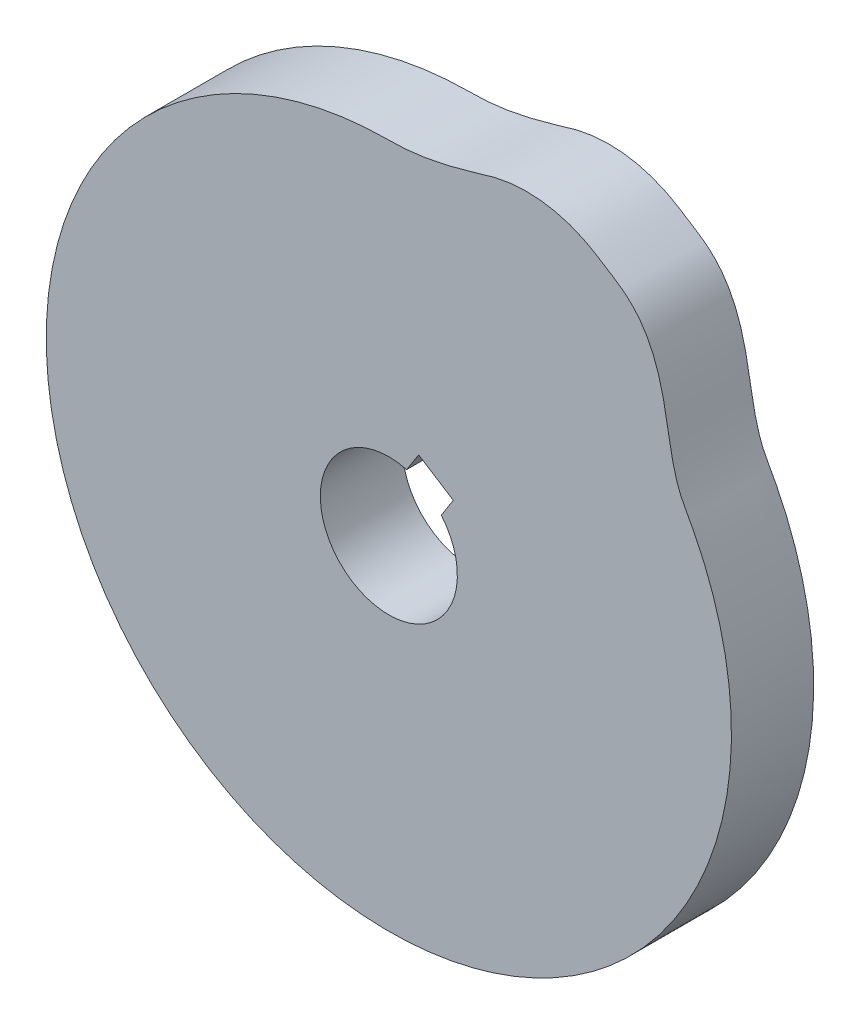
ISO-10303-21;
HEADER;
FILE_DESCRIPTION(('STEP AP214'),'2;1');
FILE_NAME('part.step','',(''),(''),'','','');
FILE_SCHEMA(('AUTOMOTIVE_DESIGN { 1 0 10303 214 1 1 1 1 }'));
ENDSEC;
DATA;
#1=APPLICATION_CONTEXT('core data for automotive mechanical design processes');
#2=APPLICATION_PROTOCOL_DEFINITION('international standard','automotive_design',2000,#1);
#3=PRODUCT_CONTEXT('',#1,'mechanical');
#4=PRODUCT('Part','Part','',(#3));
#5=PRODUCT_RELATED_PRODUCT_CATEGORY('part','',(#4));
#6=PRODUCT_DEFINITION_FORMATION('','',#4);
#7=PRODUCT_DEFINITION_CONTEXT('part definition',#1,'design');
#8=PRODUCT_DEFINITION('design','',#6,#7);
#9=PRODUCT_DEFINITION_SHAPE('','',#8);
#10=(LENGTH_UNIT() NAMED_UNIT(*) SI_UNIT(.MILLI.,.METRE.));
#11=(NAMED_UNIT(*) PLANE_ANGLE_UNIT() SI_UNIT($,.RADIAN.));
#12=(NAMED_UNIT(*) SI_UNIT($,.STERADIAN.) SOLID_ANGLE_UNIT());
#13=UNCERTAINTY_MEASURE_WITH_UNIT(LENGTH_MEASURE(1.E-05),#10,'distance_accuracy_value','');
#14=(GEOMETRIC_REPRESENTATION_CONTEXT(3) GLOBAL_UNCERTAINTY_ASSIGNED_CONTEXT((#13)) GLOBAL_UNIT_ASSIGNED_CONTEXT((#10,
#11,#12)) REPRESENTATION_CONTEXT('',''));
#15=CARTESIAN_POINT('',(0.,0.,0.));
#16=DIRECTION('',(0.,0.,1.));
#17=DIRECTION('',(1.,0.,0.));
#18=AXIS2_PLACEMENT_3D('',#15,#16,#17);
#19=CARTESIAN_POINT('',(-25.8673504127022,-42.7887857110537,12.));
#20=DIRECTION('',(0.,0.,1.));
#21=DIRECTION('',(1.,0.,0.));
#22=AXIS2_PLACEMENT_3D('',#19,#20,#21);
#23=PLANE('',#22);
#24=CARTESIAN_POINT('',(30.6076222314708,50.4398003697039,12.));
#25=CARTESIAN_POINT('',(30.4803171456213,50.5170509921739,12.));
#26=CARTESIAN_POINT('',(30.2251220550456,50.6705883206375,12.));
#27=CARTESIAN_POINT('',(29.8405717379502,50.8980039132595,12.));
#28=CARTESIAN_POINT('',(29.5830808396817,51.0476591263146,12.));
#29=CARTESIAN_POINT('',(29.45405395359,51.1219982561227,12.));
#30=CARTESIAN_POINT('',(29.3343916221048,51.190941976791,12.));
#31=CARTESIAN_POINT('',(29.0945828251039,51.3279891297548,12.));
#32=CARTESIAN_POINT('',(28.7266436495151,51.5192594054611,12.));
#33=CARTESIAN_POINT('',(28.4796336448281,51.6428921235424,12.));
#34=CARTESIAN_POINT('',(28.3554456590838,51.7033044930774,12.));
#35=CARTESIAN_POINT('',(28.1263094948855,51.8147698537758,12.));
#36=CARTESIAN_POINT('',(27.5822316556157,52.0655477221545,12.));
#37=CARTESIAN_POINT('',(26.7062807005346,52.4183726926784,12.));
#38=CARTESIAN_POINT('',(25.7253796970024,52.7508214398549,12.));
#39=CARTESIAN_POINT('',(24.7241173343735,53.0287501147325,12.));
#40=CARTESIAN_POINT('',(23.7047408080316,53.2512721730611,12.));
#41=CARTESIAN_POINT('',(22.6695261443255,53.4175728550292,12.));
#42=CARTESIAN_POINT('',(21.6207763299688,53.526913209372,12.));
#43=CARTESIAN_POINT('',(20.5608207801787,53.5786244975551,12.));
#44=CARTESIAN_POINT('',(19.4920064868158,53.572131269909,12.));
#45=CARTESIAN_POINT('',(18.4167213457121,53.5068679615972,12.));
#46=CARTESIAN_POINT('',(17.3372956630495,53.3825968058903,12.));
#47=CARTESIAN_POINT('',(16.2563642170177,53.1982084304997,12.));
#48=CARTESIAN_POINT('',(15.1754853721839,52.9562641405376,12.));
#49=CARTESIAN_POINT('',(14.1071304592976,52.6477430423425,12.));
#50=CARTESIAN_POINT('',(13.0545650116408,52.3181134437937,12.));
#51=CARTESIAN_POINT('',(12.0171036529371,52.0128716553444,12.));
#52=CARTESIAN_POINT('',(11.0033137471876,51.7244956022475,12.));
#53=CARTESIAN_POINT('',(10.0106548147003,51.4565523820743,12.));
#54=CARTESIAN_POINT('',(9.03765192704429,51.2091187240952,12.));
#55=CARTESIAN_POINT('',(8.0825275435847,50.9830913898652,12.));
#56=CARTESIAN_POINT('',(7.1435574408388,50.7790741364261,12.));
#57=CARTESIAN_POINT('',(6.21898166426566,50.5976645706676,12.));
#58=CARTESIAN_POINT('',(5.30703053672776,50.4393789888941,12.));
#59=CARTESIAN_POINT('',(4.40592081794857,50.3046710893957,12.));
#60=CARTESIAN_POINT('',(3.51385960463469,50.1939254783646,12.));
#61=CARTESIAN_POINT('',(2.91712460533482,50.1356118565322,12.));
#62=CARTESIAN_POINT('',(2.61800180454818,50.1105405983444,12.));
#63=CARTESIAN_POINT('',(2.61389346650665,50.1101970382042,12.));
#64=CARTESIAN_POINT('',(2.01333468198642,50.0599752555557,12.));
#65=CARTESIAN_POINT('',(0.809434420460247,49.9928074986587,12.));
#66=CARTESIAN_POINT('',(-1.00036901814609,50.0008931514634,12.));
#67=CARTESIAN_POINT('',(-2.20500183421003,49.9549913421296,12.));
#68=CARTESIAN_POINT('',(-2.80670661638772,49.9211618251171,12.));
#69=CARTESIAN_POINT('',(-63.6873338742389,46.4982835689369,12.));
#70=CARTESIAN_POINT('',(-77.8060253891642,-12.8214384531059,12.));
#71=CARTESIAN_POINT('',(-24.9952388642575,-43.3040186832436,12.));
#72=CARTESIAN_POINT('',(27.8155476606491,-73.7865989133813,12.));
#73=CARTESIAN_POINT('',(72.1193760763282,-31.8898489370393,12.));
#74=CARTESIAN_POINT('',(44.63139222023,22.5397166904111,12.));
#75=CARTESIAN_POINT('',(44.3606789525921,23.0757620273209,12.));
#76=CARTESIAN_POINT('',(43.7999378997362,24.1380984960259,12.));
#77=CARTESIAN_POINT('',(42.8798133871297,25.6980522472828,12.));
#78=CARTESIAN_POINT('',(42.4133557878573,26.8066577836474,12.));
#79=CARTESIAN_POINT('',(42.2101352505943,27.3717521914524,12.));
#80=CARTESIAN_POINT('',(42.2062636740594,27.3825178664119,12.));
#81=CARTESIAN_POINT('',(42.099742444955,27.6796646416382,12.));
#82=CARTESIAN_POINT('',(41.9044169904516,28.2761712878325,12.));
#83=CARTESIAN_POINT('',(41.6537837416019,29.1785444381441,12.));
#84=CARTESIAN_POINT('',(41.4310989058594,30.113836174282,12.));
#85=CARTESIAN_POINT('',(41.2298527455138,31.0806895177999,12.));
#86=CARTESIAN_POINT('',(41.0430902436905,32.0769078346977,12.));
#87=CARTESIAN_POINT('',(40.8635548181921,33.0994541734378,12.));
#88=CARTESIAN_POINT('',(40.6838232867233,34.1444730739492,12.));
#89=CARTESIAN_POINT('',(40.4964422802234,35.2073363704446,12.));
#90=CARTESIAN_POINT('',(40.2940629433141,36.2827097342524,12.));
#91=CARTESIAN_POINT('',(40.0695726358915,37.3646371946211,12.));
#92=CARTESIAN_POINT('',(39.8162208746902,38.4466406196374,12.));
#93=CARTESIAN_POINT('',(39.5277369583613,39.5218312507114,12.));
#94=CARTESIAN_POINT('',(39.1984369635733,40.5830303452907,12.));
#95=CARTESIAN_POINT('',(38.8233184291221,41.6228960086812,12.));
#96=CARTESIAN_POINT('',(38.3981416311322,42.6340532922748,12.));
#97=CARTESIAN_POINT('',(37.9194976795186,43.6092254785592,12.));
#98=CARTESIAN_POINT('',(37.3848622805764,44.5413636928394,12.));
#99=CARTESIAN_POINT('',(36.7926413670841,45.4237791301921,12.));
#100=CARTESIAN_POINT('',(36.1421870010684,46.2502617148377,12.));
#101=CARTESIAN_POINT('',(35.4949559134578,46.9492646698083,12.));
#102=CARTESIAN_POINT('',(35.0548254495986,47.3600329852479,12.));
#103=CARTESIAN_POINT('',(34.8631813053917,47.5279340218716,12.));
#104=CARTESIAN_POINT('',(34.7661714799636,47.6129251407992,12.));
#105=CARTESIAN_POINT('',(34.569445018011,47.7798177938221,12.));
#106=CARTESIAN_POINT('',(34.2704872705919,48.0269050235509,12.));
#107=CARTESIAN_POINT('',(34.06002319398,48.1760464797815,12.));
#108=CARTESIAN_POINT('',(33.9545477715554,48.250271352907,12.));
#109=CARTESIAN_POINT('',(33.8249840462497,48.3414475800452,12.));
#110=CARTESIAN_POINT('',(33.5651221045372,48.5227563038857,12.));
#111=CARTESIAN_POINT('',(33.1731222987955,48.7915900352503,12.));
#112=CARTESIAN_POINT('',(32.9103729498426,48.9686884872934,12.));
#113=CARTESIAN_POINT('',(32.7786437481565,49.0567071258502,12.));
#114=CARTESIAN_POINT('',(32.0650862591673,49.5334909969201,12.));
#115=CARTESIAN_POINT('',(31.3412975922036,49.9945952317522,12.));
#116=CARTESIAN_POINT('',(30.6076222314707,50.4398003697039,12.));
#117=(BOUNDED_CURVE() B_SPLINE_CURVE(3,(#24,#25,#26,#27,#28,#29,#30,#31,#32,#33,#34,#35,#36,#37,
#38,#39,#40,#41,#42,#43,#44,#45,#46,#47,#48,#49,#50,#51,#52,#53,#54,#55,#56,#57,#58,#59,#60,#61,
#62,#63,#64,#65,#66,#67,#68,#69,#70,#71,#72,#73,#74,#75,#76,#77,#78,#79,#80,#81,#82,#83,#84,#85,
#86,#87,#88,#89,#90,#91,#92,#93,#94,#95,#96,#97,#98,#99,#100,#101,#102,#103,#104,#105,#106,#107,
#108,#109,#110,#111,#112,#113,#114,#115,#116),.UNSPECIFIED.,.T.,
.F.) B_SPLINE_CURVE_WITH_KNOTS((4,1,1,3,1,1,3,1,1,1,1,1,1,1,1,1,1,1,1,1,1,1,1,1,1,1,1,1,1,1,1,1,
1,3,1,1,3,3,3,1,1,3,1,1,1,1,1,1,1,1,1,1,1,1,1,1,1,1,1,1,1,1,1,3,1,1,3,1,1,3,4),(0.,
0.0017280185399754,0.00345603707995079,0.00518405561992608,0.00678665747761953,
0.00838925933531287,0.00999186119300632,0.0129487820272074,0.0169424587147529,
0.0209460538675218,0.0249628609665901,0.0289961628297474,0.0330492291900335,0.0371253144284036,
0.0412276554830441,0.0453594699539005,0.0495239544167746,0.0537242829570546,0.0579636059288933,
0.062245048941568,0.0665717120709554,0.070864939049088,0.075046563540181,0.0791221355688057,
0.0830975777905617,0.0869792035696768,0.0907737311329646,0.0944882924016776,0.0981304350084975,
0.101708116010266,0.105229685944901,0.108703862183379,0.112139691008555,0.112187537200368,
0.119181715992119,0.126175894783869,0.13317007357562,0.503889424590671,0.874608775605722,
0.88157823414906,0.888547692692398,0.895517151235735,0.895649927147662,0.899180615732447,
0.902799581573738,0.906517174789711,0.910338013357844,0.914261272820478,0.918281260338315,
0.92238816590551,0.926568912100945,0.930808050060419,0.935088668650508,0.939393295706877,
0.943704775921545,0.948007110960373,0.952286244755649,0.956530771412662,0.960732535533326,
0.964887086187773,0.968993938445701,0.973056593860924,0.977082278208015,0.980038764166433,
0.981535330565025,0.983031896963616,0.984528463362207,0.986366813124752,0.988205162887297,
0.990043512649842,1.),
.UNSPECIFIED.) CURVE() GEOMETRIC_REPRESENTATION_ITEM() RATIONAL_B_SPLINE_CURVE((1.,1.,1.,1.,1.,
1.,1.,1.,1.,1.,1.,1.,1.,1.,1.,1.,1.,1.,1.,1.,1.,1.,1.,1.,1.,1.,1.,1.,1.,1.,1.,1.,1.,1.,1.,1.,1.,
1.,1.,1.,1.,1.,1.,1.,1.,0.523857144136756,0.523857144136756,1.,0.523857144136756,
0.523857144136756,1.,1.,1.,1.,1.,1.,1.,1.,1.,1.,1.,1.,1.,1.,1.,1.,1.,1.,1.,1.,1.,1.,1.,1.,1.,1.,
1.,1.,1.,1.,1.,1.,1.,1.,1.,1.,1.,1.,1.,1.,0.999841351386606,0.999841351386606,1.)) REPRESENTATION_ITEM(''));
#118=CARTESIAN_POINT('',(30.6076222314708,50.4398003697039,12.));
#119=VERTEX_POINT('',#118);
#120=EDGE_CURVE('E119',#119,#119,#117,.T.);
#121=ORIENTED_EDGE('',*,*,#120,.T.);
#122=EDGE_LOOP('',(#121));
#123=FACE_BOUND('',#122,.T.);
#124=DIRECTION('',(0.537299608346824,0.843391445812886,0.));
#125=VECTOR('',#124,1.);
#126=CARTESIAN_POINT('',(9.40760929865756,9.18351164114843,12.));
#127=LINE('',#126,#125);
#128=CARTESIAN_POINT('',(7.65568593051872,6.4335427979658,12.));
#129=VERTEX_POINT('',#128);
#130=CARTESIAN_POINT('',(9.40760929865756,9.18351164114843,12.));
#131=VERTEX_POINT('',#130);
#132=EDGE_CURVE('E93',#129,#131,#127,.T.);
#133=ORIENTED_EDGE('',*,*,#132,.F.);
#134=CARTESIAN_POINT('',(0.,0.,12.));
#135=DIRECTION('',(0.,0.,1.));
#136=DIRECTION('',(1.,0.,0.));
#137=AXIS2_PLACEMENT_3D('',#134,#135,#136);
#138=CIRCLE('',#137,10.);
#139=CARTESIAN_POINT('',(2.59533725564141,9.65734044804675,12.));
#140=VERTEX_POINT('',#139);
#141=EDGE_CURVE('E84',#140,#129,#138,.T.);
#142=ORIENTED_EDGE('',*,*,#141,.F.);
#143=DIRECTION('',(-0.537299608346824,-0.843391445812886,0.));
#144=VECTOR('',#143,1.);
#145=CARTESIAN_POINT('',(2.59533725564141,9.65734044804675,12.));
#146=LINE('',#145,#144);
#147=CARTESIAN_POINT('',(4.34726062378025,12.4073092912294,12.));
#148=VERTEX_POINT('',#147);
#149=EDGE_CURVE('E109',#148,#140,#146,.T.);
#150=ORIENTED_EDGE('',*,*,#149,.F.);
#151=DIRECTION('',(-0.843391445812886,0.537299608346824,0.));
#152=VECTOR('',#151,1.);
#153=CARTESIAN_POINT('',(4.34726062378024,12.4073092912294,12.));
#154=LINE('',#153,#152);
#155=EDGE_CURVE('E105',#131,#148,#154,.T.);
#156=ORIENTED_EDGE('',*,*,#155,.F.);
#157=EDGE_LOOP('',(#133,#142,#150,#156));
#158=FACE_BOUND('',#157,.T.);
#159=ADVANCED_FACE('F43',(#123,#158),#23,.T.);
#160=CARTESIAN_POINT('',(-25.8673504127022,-42.7887857110537,0.));
#161=DIRECTION('',(0.,0.,1.));
#162=DIRECTION('',(1.,0.,0.));
#163=AXIS2_PLACEMENT_3D('',#160,#161,#162);
#164=PLANE('',#163);
#165=CARTESIAN_POINT('',(30.6076222314708,50.4398003697039,0.));
#166=CARTESIAN_POINT('',(30.4803171456213,50.5170509921739,0.));
#167=CARTESIAN_POINT('',(30.2251220550456,50.6705883206375,0.));
#168=CARTESIAN_POINT('',(29.8405717379502,50.8980039132595,0.));
#169=CARTESIAN_POINT('',(29.5830808396817,51.0476591263146,0.));
#170=CARTESIAN_POINT('',(29.45405395359,51.1219982561227,0.));
#171=CARTESIAN_POINT('',(29.3343916221048,51.190941976791,0.));
#172=CARTESIAN_POINT('',(29.0945828251039,51.3279891297548,0.));
#173=CARTESIAN_POINT('',(28.7266436495151,51.5192594054611,0.));
#174=CARTESIAN_POINT('',(28.4796336448281,51.6428921235424,0.));
#175=CARTESIAN_POINT('',(28.3554456590838,51.7033044930774,0.));
#176=CARTESIAN_POINT('',(28.1263094948855,51.8147698537758,0.));
#177=CARTESIAN_POINT('',(27.5822316556157,52.0655477221545,0.));
#178=CARTESIAN_POINT('',(26.7062807005346,52.4183726926784,0.));
#179=CARTESIAN_POINT('',(25.7253796970024,52.7508214398549,0.));
#180=CARTESIAN_POINT('',(24.7241173343735,53.0287501147325,0.));
#181=CARTESIAN_POINT('',(23.7047408080316,53.2512721730611,0.));
#182=CARTESIAN_POINT('',(22.6695261443255,53.4175728550292,0.));
#183=CARTESIAN_POINT('',(21.6207763299688,53.526913209372,0.));
#184=CARTESIAN_POINT('',(20.5608207801787,53.5786244975551,0.));
#185=CARTESIAN_POINT('',(19.4920064868158,53.572131269909,0.));
#186=CARTESIAN_POINT('',(18.4167213457121,53.5068679615972,0.));
#187=CARTESIAN_POINT('',(17.3372956630495,53.3825968058903,0.));
#188=CARTESIAN_POINT('',(16.2563642170177,53.1982084304997,0.));
#189=CARTESIAN_POINT('',(15.1754853721839,52.9562641405376,0.));
#190=CARTESIAN_POINT('',(14.1071304592976,52.6477430423425,0.));
#191=CARTESIAN_POINT('',(13.0545650116408,52.3181134437937,0.));
#192=CARTESIAN_POINT('',(12.0171036529371,52.0128716553444,0.));
#193=CARTESIAN_POINT('',(11.0033137471876,51.7244956022475,0.));
#194=CARTESIAN_POINT('',(10.0106548147003,51.4565523820743,0.));
#195=CARTESIAN_POINT('',(9.03765192704429,51.2091187240952,0.));
#196=CARTESIAN_POINT('',(8.0825275435847,50.9830913898652,0.));
#197=CARTESIAN_POINT('',(7.1435574408388,50.7790741364261,0.));
#198=CARTESIAN_POINT('',(6.21898166426566,50.5976645706676,0.));
#199=CARTESIAN_POINT('',(5.30703053672776,50.4393789888941,0.));
#200=CARTESIAN_POINT('',(4.40592081794857,50.3046710893957,0.));
#201=CARTESIAN_POINT('',(3.51385960463469,50.1939254783646,0.));
#202=CARTESIAN_POINT('',(2.91712460533482,50.1356118565322,0.));
#203=CARTESIAN_POINT('',(2.61800180454818,50.1105405983444,0.));
#204=CARTESIAN_POINT('',(2.61389346650665,50.1101970382042,0.));
#205=CARTESIAN_POINT('',(2.01333468198642,50.0599752555557,0.));
#206=CARTESIAN_POINT('',(0.809434420460247,49.9928074986587,0.));
#207=CARTESIAN_POINT('',(-1.00036901814609,50.0008931514634,0.));
#208=CARTESIAN_POINT('',(-2.20500183421003,49.9549913421296,0.));
#209=CARTESIAN_POINT('',(-2.80670661638772,49.9211618251171,0.));
#210=CARTESIAN_POINT('',(-63.6873338742389,46.4982835689369,0.));
#211=CARTESIAN_POINT('',(-77.8060253891642,-12.8214384531059,0.));
#212=CARTESIAN_POINT('',(-24.9952388642575,-43.3040186832436,0.));
#213=CARTESIAN_POINT('',(27.8155476606491,-73.7865989133813,0.));
#214=CARTESIAN_POINT('',(72.1193760763282,-31.8898489370393,0.));
#215=CARTESIAN_POINT('',(44.63139222023,22.5397166904111,0.));
#216=CARTESIAN_POINT('',(44.3606789525921,23.0757620273209,0.));
#217=CARTESIAN_POINT('',(43.7999378997362,24.1380984960259,0.));
#218=CARTESIAN_POINT('',(42.8798133871297,25.6980522472828,0.));
#219=CARTESIAN_POINT('',(42.4133557878573,26.8066577836474,0.));
#220=CARTESIAN_POINT('',(42.2101352505943,27.3717521914524,0.));
#221=CARTESIAN_POINT('',(42.2062636740594,27.3825178664119,0.));
#222=CARTESIAN_POINT('',(42.099742444955,27.6796646416382,0.));
#223=CARTESIAN_POINT('',(41.9044169904516,28.2761712878325,0.));
#224=CARTESIAN_POINT('',(41.6537837416019,29.1785444381441,0.));
#225=CARTESIAN_POINT('',(41.4310989058594,30.113836174282,0.));
#226=CARTESIAN_POINT('',(41.2298527455138,31.0806895177999,0.));
#227=CARTESIAN_POINT('',(41.0430902436905,32.0769078346977,0.));
#228=CARTESIAN_POINT('',(40.8635548181921,33.0994541734378,0.));
#229=CARTESIAN_POINT('',(40.6838232867233,34.1444730739492,0.));
#230=CARTESIAN_POINT('',(40.4964422802234,35.2073363704446,0.));
#231=CARTESIAN_POINT('',(40.2940629433141,36.2827097342524,0.));
#232=CARTESIAN_POINT('',(40.0695726358915,37.3646371946211,0.));
#233=CARTESIAN_POINT('',(39.8162208746902,38.4466406196374,0.));
#234=CARTESIAN_POINT('',(39.5277369583613,39.5218312507114,0.));
#235=CARTESIAN_POINT('',(39.1984369635733,40.5830303452907,0.));
#236=CARTESIAN_POINT('',(38.8233184291221,41.6228960086812,0.));
#237=CARTESIAN_POINT('',(38.3981416311322,42.6340532922748,0.));
#238=CARTESIAN_POINT('',(37.9194976795186,43.6092254785592,0.));
#239=CARTESIAN_POINT('',(37.3848622805764,44.5413636928394,0.));
#240=CARTESIAN_POINT('',(36.7926413670841,45.4237791301921,0.));
#241=CARTESIAN_POINT('',(36.1421870010684,46.2502617148377,0.));
#242=CARTESIAN_POINT('',(35.4949559134578,46.9492646698083,0.));
#243=CARTESIAN_POINT('',(35.0548254495986,47.3600329852479,0.));
#244=CARTESIAN_POINT('',(34.8631813053917,47.5279340218716,0.));
#245=CARTESIAN_POINT('',(34.7661714799636,47.6129251407992,0.));
#246=CARTESIAN_POINT('',(34.569445018011,47.7798177938221,0.));
#247=CARTESIAN_POINT('',(34.2704872705919,48.0269050235509,0.));
#248=CARTESIAN_POINT('',(34.06002319398,48.1760464797815,0.));
#249=CARTESIAN_POINT('',(33.9545477715554,48.250271352907,0.));
#250=CARTESIAN_POINT('',(33.8249840462497,48.3414475800452,0.));
#251=CARTESIAN_POINT('',(33.5651221045372,48.5227563038857,0.));
#252=CARTESIAN_POINT('',(33.1731222987955,48.7915900352503,0.));
#253=CARTESIAN_POINT('',(32.9103729498426,48.9686884872934,0.));
#254=CARTESIAN_POINT('',(32.7786437481565,49.0567071258502,0.));
#255=CARTESIAN_POINT('',(32.0650862591673,49.5334909969201,0.));
#256=CARTESIAN_POINT('',(31.3412975922036,49.9945952317522,0.));
#257=CARTESIAN_POINT('',(30.6076222314707,50.4398003697039,0.));
#258=(BOUNDED_CURVE() B_SPLINE_CURVE(3,(#165,#166,#167,#168,#169,#170,#171,#172,#173,#174,#175,
#176,#177,#178,#179,#180,#181,#182,#183,#184,#185,#186,#187,#188,#189,#190,#191,#192,#193,#194,
#195,#196,#197,#198,#199,#200,#201,#202,#203,#204,#205,#206,#207,#208,#209,#210,#211,#212,#213,
#214,#215,#216,#217,#218,#219,#220,#221,#222,#223,#224,#225,#226,#227,#228,#229,#230,#231,#232,
#233,#234,#235,#236,#237,#238,#239,#240,#241,#242,#243,#244,#245,#246,#247,#248,#249,#250,#251,
#252,#253,#254,#255,#256,#257),.UNSPECIFIED.,.T.,.F.) B_SPLINE_CURVE_WITH_KNOTS((4,1,1,3,1,1,3,
1,1,1,1,1,1,1,1,1,1,1,1,1,1,1,1,1,1,1,1,1,1,1,1,1,1,3,1,1,3,3,3,1,1,3,1,1,1,1,1,1,1,1,1,1,1,1,1,
1,1,1,1,1,1,1,1,3,1,1,3,1,1,3,4),(0.,0.0017280185399754,0.00345603707995079,0.00518405561992608,
0.00678665747761953,0.00838925933531287,0.00999186119300632,0.0129487820272074,
0.0169424587147529,0.0209460538675218,0.0249628609665901,0.0289961628297474,0.0330492291900335,
0.0371253144284036,0.0412276554830441,0.0453594699539005,0.0495239544167746,0.0537242829570546,
0.0579636059288933,0.062245048941568,0.0665717120709554,0.070864939049088,0.075046563540181,
0.0791221355688057,0.0830975777905617,0.0869792035696768,0.0907737311329646,0.0944882924016776,
0.0981304350084975,0.101708116010266,0.105229685944901,0.108703862183379,0.112139691008555,
0.112187537200368,0.119181715992119,0.126175894783869,0.13317007357562,0.503889424590671,
0.874608775605722,0.88157823414906,0.888547692692398,0.895517151235735,0.895649927147662,
0.899180615732447,0.902799581573738,0.906517174789711,0.910338013357844,0.914261272820478,
0.918281260338315,0.92238816590551,0.926568912100945,0.930808050060419,0.935088668650508,
0.939393295706877,0.943704775921545,0.948007110960373,0.952286244755649,0.956530771412662,
0.960732535533326,0.964887086187773,0.968993938445701,0.973056593860924,0.977082278208015,
0.980038764166433,0.981535330565025,0.983031896963616,0.984528463362207,0.986366813124752,
0.988205162887297,0.990043512649842,1.),
.UNSPECIFIED.) CURVE() GEOMETRIC_REPRESENTATION_ITEM() RATIONAL_B_SPLINE_CURVE((1.,1.,1.,1.,1.,
1.,1.,1.,1.,1.,1.,1.,1.,1.,1.,1.,1.,1.,1.,1.,1.,1.,1.,1.,1.,1.,1.,1.,1.,1.,1.,1.,1.,1.,1.,1.,1.,
1.,1.,1.,1.,1.,1.,1.,1.,0.523857144136756,0.523857144136756,1.,0.523857144136756,
0.523857144136756,1.,1.,1.,1.,1.,1.,1.,1.,1.,1.,1.,1.,1.,1.,1.,1.,1.,1.,1.,1.,1.,1.,1.,1.,1.,1.,
1.,1.,1.,1.,1.,1.,1.,1.,1.,1.,1.,1.,1.,1.,0.999841351386606,0.999841351386606,1.)) REPRESENTATION_ITEM(''));
#259=CARTESIAN_POINT('',(30.6076222314708,50.4398003697039,0.));
#260=VERTEX_POINT('',#259);
#261=EDGE_CURVE('E101',#260,#260,#258,.T.);
#262=ORIENTED_EDGE('',*,*,#261,.F.);
#263=EDGE_LOOP('',(#262));
#264=FACE_BOUND('',#263,.T.);
#265=CARTESIAN_POINT('',(0.,0.,0.));
#266=DIRECTION('',(0.,0.,1.));
#267=DIRECTION('',(1.,0.,0.));
#268=AXIS2_PLACEMENT_3D('',#265,#266,#267);
#269=CIRCLE('',#268,10.);
#270=CARTESIAN_POINT('',(7.65568593051872,6.4335427979658,0.));
#271=VERTEX_POINT('',#270);
#272=CARTESIAN_POINT('',(2.59533725564141,9.65734044804675,0.));
#273=VERTEX_POINT('',#272);
#274=EDGE_CURVE('E11',#271,#273,#269,.F.);
#275=ORIENTED_EDGE('',*,*,#274,.F.);
#276=DIRECTION('',(-0.537299608346824,-0.843391445812886,0.));
#277=VECTOR('',#276,1.);
#278=CARTESIAN_POINT('',(-24.3273983791708,-43.7698433546866,0.));
#279=LINE('',#278,#277);
#280=CARTESIAN_POINT('',(9.40760929865756,9.18351164114843,0.));
#281=VERTEX_POINT('',#280);
#282=EDGE_CURVE('E53',#281,#271,#279,.T.);
#283=ORIENTED_EDGE('',*,*,#282,.F.);
#284=DIRECTION('',(0.843391445812886,-0.537299608346824,0.));
#285=VECTOR('',#284,1.);
#286=CARTESIAN_POINT('',(7.86765726512621,10.1645692847813,0.));
#287=LINE('',#286,#285);
#288=CARTESIAN_POINT('',(4.34726062378024,12.4073092912294,0.));
#289=VERTEX_POINT('',#288);
#290=EDGE_CURVE('E140',#289,#281,#287,.T.);
#291=ORIENTED_EDGE('',*,*,#290,.F.);
#292=DIRECTION('',(0.537299608346824,0.843391445812886,0.));
#293=VECTOR('',#292,1.);
#294=CARTESIAN_POINT('',(-29.3877470540481,-40.5460457046057,0.));
#295=LINE('',#294,#293);
#296=EDGE_CURVE('E126',#273,#289,#295,.T.);
#297=ORIENTED_EDGE('',*,*,#296,.F.);
#298=EDGE_LOOP('',(#275,#283,#291,#297));
#299=FACE_BOUND('',#298,.T.);
#300=ADVANCED_FACE('F148',(#264,#299),#164,.F.);
#301=DIRECTION('',(0.,0.,-1.));
#302=VECTOR('',#301,1.);
#303=SURFACE_OF_LINEAR_EXTRUSION('',#117,#302);
#304=ORIENTED_EDGE('',*,*,#120,.F.);
#305=EDGE_LOOP('',(#304));
#306=FACE_BOUND('',#305,.T.);
#307=ORIENTED_EDGE('',*,*,#261,.T.);
#308=EDGE_LOOP('',(#307));
#309=FACE_BOUND('',#308,.T.);
#310=ADVANCED_FACE('F45',(#306,#309),#303,.F.);
#311=CARTESIAN_POINT('',(0.,0.,12.));
#312=DIRECTION('',(0.,0.,-1.));
#313=DIRECTION('',(-1.,0.,0.));
#314=AXIS2_PLACEMENT_3D('',#311,#312,#313);
#315=CYLINDRICAL_SURFACE('',#314,10.);
#316=ORIENTED_EDGE('',*,*,#274,.T.);
#317=DIRECTION('',(0.,0.,-1.));
#318=VECTOR('',#317,1.);
#319=CARTESIAN_POINT('',(2.59533725564141,9.65734044804675,12.));
#320=LINE('',#319,#318);
#321=EDGE_CURVE('E65',#140,#273,#320,.T.);
#322=ORIENTED_EDGE('',*,*,#321,.F.);
#323=ORIENTED_EDGE('',*,*,#141,.T.);
#324=DIRECTION('',(0.,0.,-1.));
#325=VECTOR('',#324,1.);
#326=CARTESIAN_POINT('',(7.65568593051872,6.4335427979658,12.));
#327=LINE('',#326,#325);
#328=EDGE_CURVE('E87',#129,#271,#327,.T.);
#329=ORIENTED_EDGE('',*,*,#328,.T.);
#330=EDGE_LOOP('',(#316,#322,#323,#329));
#331=FACE_BOUND('',#330,.T.);
#332=ADVANCED_FACE('F86',(#331),#315,.F.);
#333=CARTESIAN_POINT('',(9.40760929865756,9.18351164114843,12.));
#334=DIRECTION('',(-0.843391445812886,0.537299608346824,0.));
#335=DIRECTION('',(-0.537299608346824,-0.843391445812886,0.));
#336=AXIS2_PLACEMENT_3D('',#333,#334,#335);
#337=PLANE('',#336);
#338=ORIENTED_EDGE('',*,*,#282,.T.);
#339=ORIENTED_EDGE('',*,*,#328,.F.);
#340=ORIENTED_EDGE('',*,*,#132,.T.);
#341=DIRECTION('',(0.,0.,-1.));
#342=VECTOR('',#341,1.);
#343=CARTESIAN_POINT('',(9.40760929865756,9.18351164114843,12.));
#344=LINE('',#343,#342);
#345=EDGE_CURVE('E102',#131,#281,#344,.T.);
#346=ORIENTED_EDGE('',*,*,#345,.T.);
#347=EDGE_LOOP('',(#338,#339,#340,#346));
#348=FACE_BOUND('',#347,.T.);
#349=ADVANCED_FACE('F96',(#348),#337,.T.);
#350=CARTESIAN_POINT('',(4.34726062378024,12.4073092912294,12.));
#351=DIRECTION('',(-0.537299608346824,-0.843391445812885,0.));
#352=DIRECTION('',(0.843391445812886,-0.537299608346824,0.));
#353=AXIS2_PLACEMENT_3D('',#350,#351,#352);
#354=PLANE('',#353);
#355=ORIENTED_EDGE('',*,*,#290,.T.);
#356=ORIENTED_EDGE('',*,*,#345,.F.);
#357=ORIENTED_EDGE('',*,*,#155,.T.);
#358=DIRECTION('',(0.,0.,-1.));
#359=VECTOR('',#358,1.);
#360=CARTESIAN_POINT('',(4.34726062378024,12.4073092912294,12.));
#361=LINE('',#360,#359);
#362=EDGE_CURVE('E60',#148,#289,#361,.T.);
#363=ORIENTED_EDGE('',*,*,#362,.T.);
#364=EDGE_LOOP('',(#355,#356,#357,#363));
#365=FACE_BOUND('',#364,.T.);
#366=ADVANCED_FACE('F145',(#365),#354,.T.);
#367=CARTESIAN_POINT('',(2.59533725564141,9.65734044804675,12.));
#368=DIRECTION('',(0.843391445812886,-0.537299608346824,0.));
#369=DIRECTION('',(0.537299608346824,0.843391445812886,0.));
#370=AXIS2_PLACEMENT_3D('',#367,#368,#369);
#371=PLANE('',#370);
#372=ORIENTED_EDGE('',*,*,#296,.T.);
#373=ORIENTED_EDGE('',*,*,#362,.F.);
#374=ORIENTED_EDGE('',*,*,#149,.T.);
#375=ORIENTED_EDGE('',*,*,#321,.T.);
#376=EDGE_LOOP('',(#372,#373,#374,#375));
#377=FACE_BOUND('',#376,.T.);
#378=ADVANCED_FACE('F149',(#377),#371,.T.);
#379=CLOSED_SHELL('',(#159,#300,#310,#332,#349,#366,#378));
#380=MANIFOLD_SOLID_BREP('B2',#379);
#381=ADVANCED_BREP_SHAPE_REPRESENTATION('',(#18,#380),#14);
#382=SHAPE_DEFINITION_REPRESENTATION(#9,#381);
ENDSEC;
END-ISO-10303-21;
